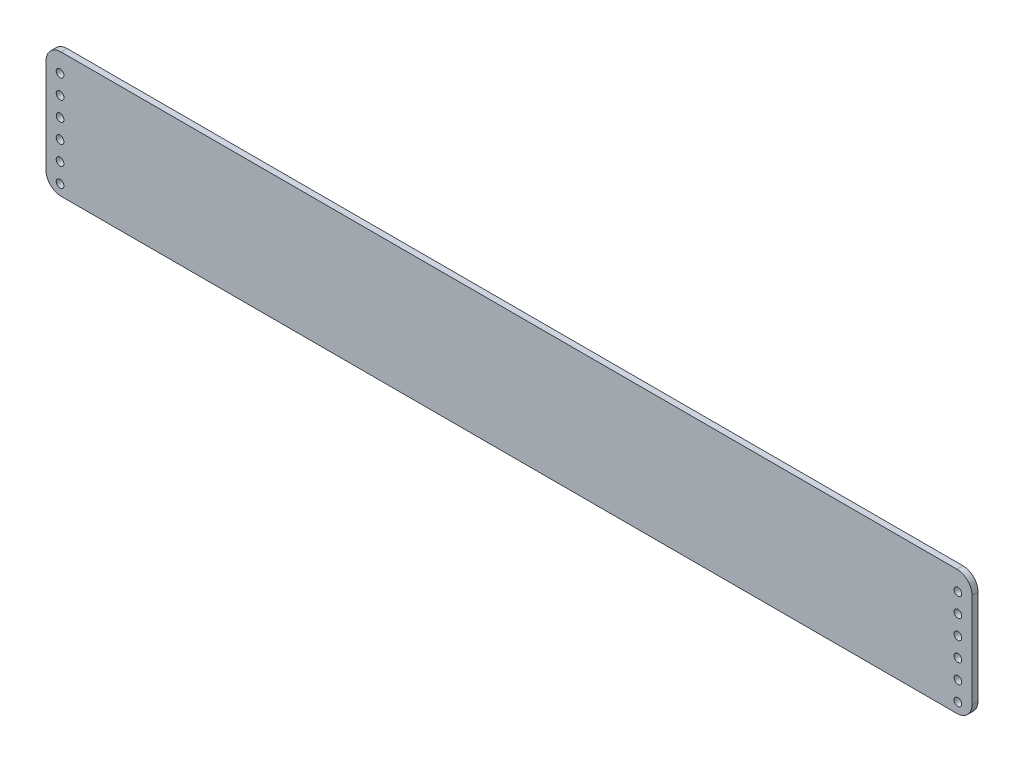
ISO-10303-21;
HEADER;
FILE_DESCRIPTION(('STEP AP214'),'2;1');
FILE_NAME('part.step','',(''),(''),'','','');
FILE_SCHEMA(('AUTOMOTIVE_DESIGN { 1 0 10303 214 1 1 1 1 }'));
ENDSEC;
DATA;
#1=APPLICATION_CONTEXT('core data for automotive mechanical design processes');
#2=APPLICATION_PROTOCOL_DEFINITION('international standard','automotive_design',2000,#1);
#3=PRODUCT_CONTEXT('',#1,'mechanical');
#4=PRODUCT('Part','Part','',(#3));
#5=PRODUCT_RELATED_PRODUCT_CATEGORY('part','',(#4));
#6=PRODUCT_DEFINITION_FORMATION('','',#4);
#7=PRODUCT_DEFINITION_CONTEXT('part definition',#1,'design');
#8=PRODUCT_DEFINITION('design','',#6,#7);
#9=PRODUCT_DEFINITION_SHAPE('','',#8);
#10=(LENGTH_UNIT() NAMED_UNIT(*) SI_UNIT(.MILLI.,.METRE.));
#11=(NAMED_UNIT(*) PLANE_ANGLE_UNIT() SI_UNIT($,.RADIAN.));
#12=(NAMED_UNIT(*) SI_UNIT($,.STERADIAN.) SOLID_ANGLE_UNIT());
#13=UNCERTAINTY_MEASURE_WITH_UNIT(LENGTH_MEASURE(1.E-05),#10,'distance_accuracy_value','');
#14=(GEOMETRIC_REPRESENTATION_CONTEXT(3) GLOBAL_UNCERTAINTY_ASSIGNED_CONTEXT((#13)) GLOBAL_UNIT_ASSIGNED_CONTEXT((#10,
#11,#12)) REPRESENTATION_CONTEXT('',''));
#15=CARTESIAN_POINT('',(0.,0.,0.));
#16=DIRECTION('',(0.,0.,1.));
#17=DIRECTION('',(1.,0.,0.));
#18=AXIS2_PLACEMENT_3D('',#15,#16,#17);
#19=CARTESIAN_POINT('',(0.,0.,4.));
#20=DIRECTION('',(0.,0.,1.));
#21=DIRECTION('',(1.,0.,0.));
#22=AXIS2_PLACEMENT_3D('',#19,#20,#21);
#23=PLANE('',#22);
#24=CARTESIAN_POINT('',(-298.155,28.8999999999998,4.));
#25=DIRECTION('',(0.,0.,1.));
#26=DIRECTION('',(1.,0.,0.));
#27=AXIS2_PLACEMENT_3D('',#24,#25,#26);
#28=CIRCLE('',#27,2.55499999999998);
#29=CARTESIAN_POINT('',(-295.6,28.8999999999998,4.));
#30=VERTEX_POINT('',#29);
#31=EDGE_CURVE('E238',#30,#30,#28,.T.);
#32=ORIENTED_EDGE('',*,*,#31,.F.);
#33=EDGE_LOOP('',(#32));
#34=FACE_BOUND('',#33,.T.);
#35=CARTESIAN_POINT('',(298.155,-21.9000000000002,4.));
#36=DIRECTION('',(0.,0.,1.));
#37=DIRECTION('',(-1.,0.,0.));
#38=AXIS2_PLACEMENT_3D('',#35,#36,#37);
#39=CIRCLE('',#38,2.55499999999998);
#40=CARTESIAN_POINT('',(295.6,-21.9000000000002,4.));
#41=VERTEX_POINT('',#40);
#42=EDGE_CURVE('E226',#41,#41,#39,.T.);
#43=ORIENTED_EDGE('',*,*,#42,.F.);
#44=EDGE_LOOP('',(#43));
#45=FACE_BOUND('',#44,.T.);
#46=CARTESIAN_POINT('',(298.155,3.49999999999982,4.));
#47=DIRECTION('',(0.,0.,1.));
#48=DIRECTION('',(-1.,0.,0.));
#49=AXIS2_PLACEMENT_3D('',#46,#47,#48);
#50=CIRCLE('',#49,2.55499999999998);
#51=CARTESIAN_POINT('',(295.6,3.49999999999982,4.));
#52=VERTEX_POINT('',#51);
#53=EDGE_CURVE('E214',#52,#52,#50,.T.);
#54=ORIENTED_EDGE('',*,*,#53,.F.);
#55=EDGE_LOOP('',(#54));
#56=FACE_BOUND('',#55,.T.);
#57=CARTESIAN_POINT('',(-298.155,16.1999999999998,4.));
#58=DIRECTION('',(0.,0.,1.));
#59=DIRECTION('',(1.,0.,0.));
#60=AXIS2_PLACEMENT_3D('',#57,#58,#59);
#61=CIRCLE('',#60,2.55499999999998);
#62=CARTESIAN_POINT('',(-295.6,16.1999999999998,4.));
#63=VERTEX_POINT('',#62);
#64=EDGE_CURVE('E202',#63,#63,#61,.T.);
#65=ORIENTED_EDGE('',*,*,#64,.F.);
#66=EDGE_LOOP('',(#65));
#67=FACE_BOUND('',#66,.T.);
#68=CARTESIAN_POINT('',(-298.155,-9.20000000000026,4.));
#69=DIRECTION('',(0.,0.,1.));
#70=DIRECTION('',(1.,0.,0.));
#71=AXIS2_PLACEMENT_3D('',#68,#69,#70);
#72=CIRCLE('',#71,2.55499999999998);
#73=CARTESIAN_POINT('',(-295.6,-9.20000000000026,4.));
#74=VERTEX_POINT('',#73);
#75=EDGE_CURVE('E190',#74,#74,#72,.T.);
#76=ORIENTED_EDGE('',*,*,#75,.F.);
#77=EDGE_LOOP('',(#76));
#78=FACE_BOUND('',#77,.T.);
#79=CARTESIAN_POINT('',(-298.155,-34.6000000000003,4.));
#80=DIRECTION('',(0.,0.,1.));
#81=DIRECTION('',(1.,0.,0.));
#82=AXIS2_PLACEMENT_3D('',#79,#80,#81);
#83=CIRCLE('',#82,2.55499999999998);
#84=CARTESIAN_POINT('',(-295.6,-34.6000000000003,4.));
#85=VERTEX_POINT('',#84);
#86=EDGE_CURVE('E174',#85,#85,#83,.T.);
#87=ORIENTED_EDGE('',*,*,#86,.F.);
#88=EDGE_LOOP('',(#87));
#89=FACE_BOUND('',#88,.T.);
#90=DIRECTION('',(0.,-1.,0.));
#91=VECTOR('',#90,1.);
#92=CARTESIAN_POINT('',(-307.5,41.5000000000002,4.));
#93=LINE('',#92,#91);
#94=CARTESIAN_POINT('',(-307.5,31.5000000000001,4.));
#95=VERTEX_POINT('',#94);
#96=CARTESIAN_POINT('',(-307.5,-31.5000000000003,4.));
#97=VERTEX_POINT('',#96);
#98=EDGE_CURVE('E178',#95,#97,#93,.T.);
#99=ORIENTED_EDGE('',*,*,#98,.T.);
#100=CARTESIAN_POINT('',(-297.5,-31.5000000000003,4.));
#101=DIRECTION('',(0.,0.,1.));
#102=DIRECTION('',(1.,0.,0.));
#103=AXIS2_PLACEMENT_3D('',#100,#101,#102);
#104=CIRCLE('',#103,10.);
#105=CARTESIAN_POINT('',(-297.5,-41.5000000000003,4.));
#106=VERTEX_POINT('',#105);
#107=EDGE_CURVE('E155',#97,#106,#104,.T.);
#108=ORIENTED_EDGE('',*,*,#107,.T.);
#109=DIRECTION('',(1.,0.,0.));
#110=VECTOR('',#109,1.);
#111=CARTESIAN_POINT('',(-307.5,-41.5000000000003,4.));
#112=LINE('',#111,#110);
#113=CARTESIAN_POINT('',(297.5,-41.5000000000002,4.));
#114=VERTEX_POINT('',#113);
#115=EDGE_CURVE('E126',#106,#114,#112,.T.);
#116=ORIENTED_EDGE('',*,*,#115,.T.);
#117=CARTESIAN_POINT('',(297.5,-31.5000000000002,4.));
#118=DIRECTION('',(0.,0.,1.));
#119=DIRECTION('',(1.,0.,0.));
#120=AXIS2_PLACEMENT_3D('',#117,#118,#119);
#121=CIRCLE('',#120,10.);
#122=CARTESIAN_POINT('',(307.5,-31.5000000000002,4.));
#123=VERTEX_POINT('',#122);
#124=EDGE_CURVE('E151',#114,#123,#121,.T.);
#125=ORIENTED_EDGE('',*,*,#124,.T.);
#126=DIRECTION('',(0.,1.,0.));
#127=VECTOR('',#126,1.);
#128=CARTESIAN_POINT('',(307.5,41.4999999999998,4.));
#129=LINE('',#128,#127);
#130=CARTESIAN_POINT('',(307.5,31.4999999999998,4.));
#131=VERTEX_POINT('',#130);
#132=EDGE_CURVE('E134',#123,#131,#129,.T.);
#133=ORIENTED_EDGE('',*,*,#132,.T.);
#134=CARTESIAN_POINT('',(297.5,31.4999999999998,4.));
#135=DIRECTION('',(0.,0.,1.));
#136=DIRECTION('',(1.,0.,0.));
#137=AXIS2_PLACEMENT_3D('',#134,#135,#136);
#138=CIRCLE('',#137,10.);
#139=CARTESIAN_POINT('',(297.5,41.4999999999998,4.));
#140=VERTEX_POINT('',#139);
#141=EDGE_CURVE('E61',#131,#140,#138,.T.);
#142=ORIENTED_EDGE('',*,*,#141,.T.);
#143=DIRECTION('',(-1.,0.,0.));
#144=VECTOR('',#143,1.);
#145=CARTESIAN_POINT('',(-307.5,41.5000000000002,4.));
#146=LINE('',#145,#144);
#147=CARTESIAN_POINT('',(-297.5,41.5000000000002,4.));
#148=VERTEX_POINT('',#147);
#149=EDGE_CURVE('E137',#140,#148,#146,.T.);
#150=ORIENTED_EDGE('',*,*,#149,.T.);
#151=CARTESIAN_POINT('',(-297.5,31.5000000000002,4.));
#152=DIRECTION('',(0.,0.,1.));
#153=DIRECTION('',(1.,0.,0.));
#154=AXIS2_PLACEMENT_3D('',#151,#152,#153);
#155=CIRCLE('',#154,10.);
#156=EDGE_CURVE('E153',#148,#95,#155,.T.);
#157=ORIENTED_EDGE('',*,*,#156,.T.);
#158=EDGE_LOOP('',(#99,#108,#116,#125,#133,#142,#150,#157));
#159=FACE_BOUND('',#158,.T.);
#160=CARTESIAN_POINT('',(-298.155,-21.9000000000003,4.));
#161=DIRECTION('',(0.,0.,1.));
#162=DIRECTION('',(1.,0.,0.));
#163=AXIS2_PLACEMENT_3D('',#160,#161,#162);
#164=CIRCLE('',#163,2.55499999999998);
#165=CARTESIAN_POINT('',(-295.6,-21.9000000000003,4.));
#166=VERTEX_POINT('',#165);
#167=EDGE_CURVE('E184',#166,#166,#164,.T.);
#168=ORIENTED_EDGE('',*,*,#167,.F.);
#169=EDGE_LOOP('',(#168));
#170=FACE_BOUND('',#169,.T.);
#171=CARTESIAN_POINT('',(-298.155,3.49999999999975,4.));
#172=DIRECTION('',(0.,0.,1.));
#173=DIRECTION('',(1.,0.,0.));
#174=AXIS2_PLACEMENT_3D('',#171,#172,#173);
#175=CIRCLE('',#174,2.55499999999998);
#176=CARTESIAN_POINT('',(-295.6,3.49999999999975,4.));
#177=VERTEX_POINT('',#176);
#178=EDGE_CURVE('E196',#177,#177,#175,.T.);
#179=ORIENTED_EDGE('',*,*,#178,.F.);
#180=EDGE_LOOP('',(#179));
#181=FACE_BOUND('',#180,.T.);
#182=CARTESIAN_POINT('',(298.155,16.1999999999998,4.));
#183=DIRECTION('',(0.,0.,1.));
#184=DIRECTION('',(-1.,0.,0.));
#185=AXIS2_PLACEMENT_3D('',#182,#183,#184);
#186=CIRCLE('',#185,2.55499999999998);
#187=CARTESIAN_POINT('',(295.6,16.1999999999998,4.));
#188=VERTEX_POINT('',#187);
#189=EDGE_CURVE('E208',#188,#188,#186,.T.);
#190=ORIENTED_EDGE('',*,*,#189,.F.);
#191=EDGE_LOOP('',(#190));
#192=FACE_BOUND('',#191,.T.);
#193=CARTESIAN_POINT('',(298.155,-9.20000000000018,4.));
#194=DIRECTION('',(0.,0.,1.));
#195=DIRECTION('',(-1.,0.,0.));
#196=AXIS2_PLACEMENT_3D('',#193,#194,#195);
#197=CIRCLE('',#196,2.55499999999998);
#198=CARTESIAN_POINT('',(295.6,-9.20000000000018,4.));
#199=VERTEX_POINT('',#198);
#200=EDGE_CURVE('E220',#199,#199,#197,.T.);
#201=ORIENTED_EDGE('',*,*,#200,.F.);
#202=EDGE_LOOP('',(#201));
#203=FACE_BOUND('',#202,.T.);
#204=CARTESIAN_POINT('',(298.155,-34.6000000000002,4.));
#205=DIRECTION('',(0.,0.,1.));
#206=DIRECTION('',(-1.,0.,0.));
#207=AXIS2_PLACEMENT_3D('',#204,#205,#206);
#208=CIRCLE('',#207,2.55499999999998);
#209=CARTESIAN_POINT('',(295.6,-34.6000000000002,4.));
#210=VERTEX_POINT('',#209);
#211=EDGE_CURVE('E232',#210,#210,#208,.T.);
#212=ORIENTED_EDGE('',*,*,#211,.F.);
#213=EDGE_LOOP('',(#212));
#214=FACE_BOUND('',#213,.T.);
#215=CARTESIAN_POINT('',(298.155,28.8999999999998,4.));
#216=DIRECTION('',(0.,0.,1.));
#217=DIRECTION('',(-1.,0.,0.));
#218=AXIS2_PLACEMENT_3D('',#215,#216,#217);
#219=CIRCLE('',#218,2.55499999999998);
#220=CARTESIAN_POINT('',(295.6,28.8999999999998,4.));
#221=VERTEX_POINT('',#220);
#222=EDGE_CURVE('E244',#221,#221,#219,.T.);
#223=ORIENTED_EDGE('',*,*,#222,.F.);
#224=EDGE_LOOP('',(#223));
#225=FACE_BOUND('',#224,.T.);
#226=ADVANCED_FACE('F39',(#34,#45,#56,#67,#78,#89,#159,#170,#181,#192,#203,#214,#225),#23,.T.);
#227=CARTESIAN_POINT('',(0.,0.,0.));
#228=DIRECTION('',(0.,0.,1.));
#229=DIRECTION('',(1.,0.,0.));
#230=AXIS2_PLACEMENT_3D('',#227,#228,#229);
#231=PLANE('',#230);
#232=DIRECTION('',(1.,0.,0.));
#233=VECTOR('',#232,1.);
#234=CARTESIAN_POINT('',(-307.5,-41.5000000000003,0.));
#235=LINE('',#234,#233);
#236=CARTESIAN_POINT('',(-297.5,-41.5000000000003,0.));
#237=VERTEX_POINT('',#236);
#238=CARTESIAN_POINT('',(297.5,-41.5000000000002,0.));
#239=VERTEX_POINT('',#238);
#240=EDGE_CURVE('E123',#237,#239,#235,.T.);
#241=ORIENTED_EDGE('',*,*,#240,.F.);
#242=CARTESIAN_POINT('',(-297.5,-31.5000000000003,0.));
#243=DIRECTION('',(0.,0.,1.));
#244=DIRECTION('',(1.,0.,0.));
#245=AXIS2_PLACEMENT_3D('',#242,#243,#244);
#246=CIRCLE('',#245,10.);
#247=CARTESIAN_POINT('',(-307.5,-31.5000000000003,0.));
#248=VERTEX_POINT('',#247);
#249=EDGE_CURVE('E106',#237,#248,#246,.F.);
#250=ORIENTED_EDGE('',*,*,#249,.T.);
#251=DIRECTION('',(0.,-1.,0.));
#252=VECTOR('',#251,1.);
#253=CARTESIAN_POINT('',(-307.5,41.5000000000002,0.));
#254=LINE('',#253,#252);
#255=CARTESIAN_POINT('',(-307.5,31.5000000000001,0.));
#256=VERTEX_POINT('',#255);
#257=EDGE_CURVE('E135',#256,#248,#254,.T.);
#258=ORIENTED_EDGE('',*,*,#257,.F.);
#259=CARTESIAN_POINT('',(-297.5,31.5000000000002,0.));
#260=DIRECTION('',(0.,0.,1.));
#261=DIRECTION('',(1.,0.,0.));
#262=AXIS2_PLACEMENT_3D('',#259,#260,#261);
#263=CIRCLE('',#262,10.);
#264=CARTESIAN_POINT('',(-297.5,41.5000000000002,0.));
#265=VERTEX_POINT('',#264);
#266=EDGE_CURVE('E117',#256,#265,#263,.F.);
#267=ORIENTED_EDGE('',*,*,#266,.T.);
#268=DIRECTION('',(-1.,0.,0.));
#269=VECTOR('',#268,1.);
#270=CARTESIAN_POINT('',(-307.5,41.5000000000002,0.));
#271=LINE('',#270,#269);
#272=CARTESIAN_POINT('',(297.5,41.4999999999998,0.));
#273=VERTEX_POINT('',#272);
#274=EDGE_CURVE('E139',#273,#265,#271,.T.);
#275=ORIENTED_EDGE('',*,*,#274,.F.);
#276=CARTESIAN_POINT('',(297.5,31.4999999999998,0.));
#277=DIRECTION('',(0.,0.,1.));
#278=DIRECTION('',(1.,0.,0.));
#279=AXIS2_PLACEMENT_3D('',#276,#277,#278);
#280=CIRCLE('',#279,10.);
#281=CARTESIAN_POINT('',(307.5,31.4999999999998,0.));
#282=VERTEX_POINT('',#281);
#283=EDGE_CURVE('E127',#273,#282,#280,.F.);
#284=ORIENTED_EDGE('',*,*,#283,.T.);
#285=DIRECTION('',(0.,1.,0.));
#286=VECTOR('',#285,1.);
#287=CARTESIAN_POINT('',(307.5,41.4999999999998,0.));
#288=LINE('',#287,#286);
#289=CARTESIAN_POINT('',(307.5,-31.5000000000002,0.));
#290=VERTEX_POINT('',#289);
#291=EDGE_CURVE('E166',#290,#282,#288,.T.);
#292=ORIENTED_EDGE('',*,*,#291,.F.);
#293=CARTESIAN_POINT('',(297.5,-31.5000000000002,0.));
#294=DIRECTION('',(0.,0.,1.));
#295=DIRECTION('',(1.,0.,0.));
#296=AXIS2_PLACEMENT_3D('',#293,#294,#295);
#297=CIRCLE('',#296,10.);
#298=EDGE_CURVE('E133',#290,#239,#297,.F.);
#299=ORIENTED_EDGE('',*,*,#298,.T.);
#300=EDGE_LOOP('',(#241,#250,#258,#267,#275,#284,#292,#299));
#301=FACE_BOUND('',#300,.T.);
#302=CARTESIAN_POINT('',(-298.155,-34.6000000000003,0.));
#303=DIRECTION('',(0.,0.,1.));
#304=DIRECTION('',(1.,0.,0.));
#305=AXIS2_PLACEMENT_3D('',#302,#303,#304);
#306=CIRCLE('',#305,2.55499999999998);
#307=CARTESIAN_POINT('',(-295.6,-34.6000000000003,0.));
#308=VERTEX_POINT('',#307);
#309=EDGE_CURVE('E181',#308,#308,#306,.T.);
#310=ORIENTED_EDGE('',*,*,#309,.T.);
#311=EDGE_LOOP('',(#310));
#312=FACE_BOUND('',#311,.T.);
#313=CARTESIAN_POINT('',(-298.155,-21.9000000000003,0.));
#314=DIRECTION('',(0.,0.,1.));
#315=DIRECTION('',(1.,0.,0.));
#316=AXIS2_PLACEMENT_3D('',#313,#314,#315);
#317=CIRCLE('',#316,2.55499999999998);
#318=CARTESIAN_POINT('',(-295.6,-21.9000000000003,0.));
#319=VERTEX_POINT('',#318);
#320=EDGE_CURVE('E187',#319,#319,#317,.T.);
#321=ORIENTED_EDGE('',*,*,#320,.T.);
#322=EDGE_LOOP('',(#321));
#323=FACE_BOUND('',#322,.T.);
#324=CARTESIAN_POINT('',(-298.155,-9.20000000000026,0.));
#325=DIRECTION('',(0.,0.,1.));
#326=DIRECTION('',(1.,0.,0.));
#327=AXIS2_PLACEMENT_3D('',#324,#325,#326);
#328=CIRCLE('',#327,2.55499999999998);
#329=CARTESIAN_POINT('',(-295.6,-9.20000000000026,0.));
#330=VERTEX_POINT('',#329);
#331=EDGE_CURVE('E193',#330,#330,#328,.T.);
#332=ORIENTED_EDGE('',*,*,#331,.T.);
#333=EDGE_LOOP('',(#332));
#334=FACE_BOUND('',#333,.T.);
#335=CARTESIAN_POINT('',(-298.155,3.49999999999975,0.));
#336=DIRECTION('',(0.,0.,1.));
#337=DIRECTION('',(1.,0.,0.));
#338=AXIS2_PLACEMENT_3D('',#335,#336,#337);
#339=CIRCLE('',#338,2.55499999999998);
#340=CARTESIAN_POINT('',(-295.6,3.49999999999975,0.));
#341=VERTEX_POINT('',#340);
#342=EDGE_CURVE('E199',#341,#341,#339,.T.);
#343=ORIENTED_EDGE('',*,*,#342,.T.);
#344=EDGE_LOOP('',(#343));
#345=FACE_BOUND('',#344,.T.);
#346=CARTESIAN_POINT('',(-298.155,16.1999999999998,0.));
#347=DIRECTION('',(0.,0.,1.));
#348=DIRECTION('',(1.,0.,0.));
#349=AXIS2_PLACEMENT_3D('',#346,#347,#348);
#350=CIRCLE('',#349,2.55499999999998);
#351=CARTESIAN_POINT('',(-295.6,16.1999999999998,0.));
#352=VERTEX_POINT('',#351);
#353=EDGE_CURVE('E205',#352,#352,#350,.T.);
#354=ORIENTED_EDGE('',*,*,#353,.T.);
#355=EDGE_LOOP('',(#354));
#356=FACE_BOUND('',#355,.T.);
#357=CARTESIAN_POINT('',(298.155,16.1999999999998,0.));
#358=DIRECTION('',(0.,0.,1.));
#359=DIRECTION('',(-1.,0.,0.));
#360=AXIS2_PLACEMENT_3D('',#357,#358,#359);
#361=CIRCLE('',#360,2.55499999999998);
#362=CARTESIAN_POINT('',(295.6,16.1999999999998,0.));
#363=VERTEX_POINT('',#362);
#364=EDGE_CURVE('E211',#363,#363,#361,.T.);
#365=ORIENTED_EDGE('',*,*,#364,.T.);
#366=EDGE_LOOP('',(#365));
#367=FACE_BOUND('',#366,.T.);
#368=CARTESIAN_POINT('',(298.155,3.49999999999982,0.));
#369=DIRECTION('',(0.,0.,1.));
#370=DIRECTION('',(-1.,0.,0.));
#371=AXIS2_PLACEMENT_3D('',#368,#369,#370);
#372=CIRCLE('',#371,2.55499999999998);
#373=CARTESIAN_POINT('',(295.6,3.49999999999982,0.));
#374=VERTEX_POINT('',#373);
#375=EDGE_CURVE('E217',#374,#374,#372,.T.);
#376=ORIENTED_EDGE('',*,*,#375,.T.);
#377=EDGE_LOOP('',(#376));
#378=FACE_BOUND('',#377,.T.);
#379=CARTESIAN_POINT('',(298.155,-9.20000000000018,0.));
#380=DIRECTION('',(0.,0.,1.));
#381=DIRECTION('',(-1.,0.,0.));
#382=AXIS2_PLACEMENT_3D('',#379,#380,#381);
#383=CIRCLE('',#382,2.55499999999998);
#384=CARTESIAN_POINT('',(295.6,-9.20000000000018,0.));
#385=VERTEX_POINT('',#384);
#386=EDGE_CURVE('E223',#385,#385,#383,.T.);
#387=ORIENTED_EDGE('',*,*,#386,.T.);
#388=EDGE_LOOP('',(#387));
#389=FACE_BOUND('',#388,.T.);
#390=CARTESIAN_POINT('',(298.155,-21.9000000000002,0.));
#391=DIRECTION('',(0.,0.,1.));
#392=DIRECTION('',(-1.,0.,0.));
#393=AXIS2_PLACEMENT_3D('',#390,#391,#392);
#394=CIRCLE('',#393,2.55499999999998);
#395=CARTESIAN_POINT('',(295.6,-21.9000000000002,0.));
#396=VERTEX_POINT('',#395);
#397=EDGE_CURVE('E229',#396,#396,#394,.T.);
#398=ORIENTED_EDGE('',*,*,#397,.T.);
#399=EDGE_LOOP('',(#398));
#400=FACE_BOUND('',#399,.T.);
#401=CARTESIAN_POINT('',(298.155,-34.6000000000002,0.));
#402=DIRECTION('',(0.,0.,1.));
#403=DIRECTION('',(-1.,0.,0.));
#404=AXIS2_PLACEMENT_3D('',#401,#402,#403);
#405=CIRCLE('',#404,2.55499999999998);
#406=CARTESIAN_POINT('',(295.6,-34.6000000000002,0.));
#407=VERTEX_POINT('',#406);
#408=EDGE_CURVE('E235',#407,#407,#405,.T.);
#409=ORIENTED_EDGE('',*,*,#408,.T.);
#410=EDGE_LOOP('',(#409));
#411=FACE_BOUND('',#410,.T.);
#412=CARTESIAN_POINT('',(-298.155,28.8999999999998,0.));
#413=DIRECTION('',(0.,0.,1.));
#414=DIRECTION('',(1.,0.,0.));
#415=AXIS2_PLACEMENT_3D('',#412,#413,#414);
#416=CIRCLE('',#415,2.55499999999998);
#417=CARTESIAN_POINT('',(-295.6,28.8999999999998,0.));
#418=VERTEX_POINT('',#417);
#419=EDGE_CURVE('E241',#418,#418,#416,.T.);
#420=ORIENTED_EDGE('',*,*,#419,.T.);
#421=EDGE_LOOP('',(#420));
#422=FACE_BOUND('',#421,.T.);
#423=CARTESIAN_POINT('',(298.155,28.8999999999998,0.));
#424=DIRECTION('',(0.,0.,1.));
#425=DIRECTION('',(-1.,0.,0.));
#426=AXIS2_PLACEMENT_3D('',#423,#424,#425);
#427=CIRCLE('',#426,2.55499999999998);
#428=CARTESIAN_POINT('',(295.6,28.8999999999998,0.));
#429=VERTEX_POINT('',#428);
#430=EDGE_CURVE('E247',#429,#429,#427,.T.);
#431=ORIENTED_EDGE('',*,*,#430,.T.);
#432=EDGE_LOOP('',(#431));
#433=FACE_BOUND('',#432,.T.);
#434=ADVANCED_FACE('F130',(#301,#312,#323,#334,#345,#356,#367,#378,#389,#400,#411,#422,#433),
#231,.F.);
#435=CARTESIAN_POINT('',(307.5,41.4999999999998,4.));
#436=DIRECTION('',(-1.,0.,0.));
#437=DIRECTION('',(0.,-1.,0.));
#438=AXIS2_PLACEMENT_3D('',#435,#436,#437);
#439=PLANE('',#438);
#440=ORIENTED_EDGE('',*,*,#132,.F.);
#441=DIRECTION('',(0.,0.,-1.));
#442=VECTOR('',#441,1.);
#443=CARTESIAN_POINT('',(307.5,-31.5000000000002,4.));
#444=LINE('',#443,#442);
#445=EDGE_CURVE('E11',#123,#290,#444,.T.);
#446=ORIENTED_EDGE('',*,*,#445,.T.);
#447=ORIENTED_EDGE('',*,*,#291,.T.);
#448=DIRECTION('',(0.,0.,-1.));
#449=VECTOR('',#448,1.);
#450=CARTESIAN_POINT('',(307.5,31.4999999999998,4.));
#451=LINE('',#450,#449);
#452=EDGE_CURVE('E47',#282,#131,#451,.F.);
#453=ORIENTED_EDGE('',*,*,#452,.T.);
#454=EDGE_LOOP('',(#440,#446,#447,#453));
#455=FACE_BOUND('',#454,.T.);
#456=ADVANCED_FACE('F164',(#455),#439,.F.);
#457=CARTESIAN_POINT('',(-307.5,41.5000000000002,4.));
#458=DIRECTION('',(0.,-1.,0.));
#459=DIRECTION('',(1.,0.,0.));
#460=AXIS2_PLACEMENT_3D('',#457,#458,#459);
#461=PLANE('',#460);
#462=ORIENTED_EDGE('',*,*,#274,.T.);
#463=DIRECTION('',(0.,0.,-1.));
#464=VECTOR('',#463,1.);
#465=CARTESIAN_POINT('',(-297.5,41.5000000000002,4.));
#466=LINE('',#465,#464);
#467=EDGE_CURVE('E54',#265,#148,#466,.F.);
#468=ORIENTED_EDGE('',*,*,#467,.T.);
#469=ORIENTED_EDGE('',*,*,#149,.F.);
#470=DIRECTION('',(0.,0.,-1.));
#471=VECTOR('',#470,1.);
#472=CARTESIAN_POINT('',(297.5,41.4999999999998,4.));
#473=LINE('',#472,#471);
#474=EDGE_CURVE('E157',#140,#273,#473,.T.);
#475=ORIENTED_EDGE('',*,*,#474,.T.);
#476=EDGE_LOOP('',(#462,#468,#469,#475));
#477=FACE_BOUND('',#476,.T.);
#478=ADVANCED_FACE('F173',(#477),#461,.F.);
#479=CARTESIAN_POINT('',(-307.5,41.5000000000002,4.));
#480=DIRECTION('',(1.,0.,0.));
#481=DIRECTION('',(0.,1.,0.));
#482=AXIS2_PLACEMENT_3D('',#479,#480,#481);
#483=PLANE('',#482);
#484=ORIENTED_EDGE('',*,*,#257,.T.);
#485=DIRECTION('',(0.,0.,-1.));
#486=VECTOR('',#485,1.);
#487=CARTESIAN_POINT('',(-307.5,-31.5000000000003,4.));
#488=LINE('',#487,#486);
#489=EDGE_CURVE('E111',#248,#97,#488,.F.);
#490=ORIENTED_EDGE('',*,*,#489,.T.);
#491=ORIENTED_EDGE('',*,*,#98,.F.);
#492=DIRECTION('',(0.,0.,-1.));
#493=VECTOR('',#492,1.);
#494=CARTESIAN_POINT('',(-307.5,31.5000000000001,4.));
#495=LINE('',#494,#493);
#496=EDGE_CURVE('E116',#95,#256,#495,.T.);
#497=ORIENTED_EDGE('',*,*,#496,.T.);
#498=EDGE_LOOP('',(#484,#490,#491,#497));
#499=FACE_BOUND('',#498,.T.);
#500=ADVANCED_FACE('F272',(#499),#483,.F.);
#501=CARTESIAN_POINT('',(-307.5,-41.5000000000003,4.));
#502=DIRECTION('',(0.,1.,0.));
#503=DIRECTION('',(-1.,0.,0.));
#504=AXIS2_PLACEMENT_3D('',#501,#502,#503);
#505=PLANE('',#504);
#506=ORIENTED_EDGE('',*,*,#115,.F.);
#507=DIRECTION('',(0.,0.,-1.));
#508=VECTOR('',#507,1.);
#509=CARTESIAN_POINT('',(-297.5,-41.5000000000003,4.));
#510=LINE('',#509,#508);
#511=EDGE_CURVE('E110',#106,#237,#510,.T.);
#512=ORIENTED_EDGE('',*,*,#511,.T.);
#513=ORIENTED_EDGE('',*,*,#240,.T.);
#514=DIRECTION('',(0.,0.,-1.));
#515=VECTOR('',#514,1.);
#516=CARTESIAN_POINT('',(297.5,-41.5000000000002,4.));
#517=LINE('',#516,#515);
#518=EDGE_CURVE('E128',#239,#114,#517,.F.);
#519=ORIENTED_EDGE('',*,*,#518,.T.);
#520=EDGE_LOOP('',(#506,#512,#513,#519));
#521=FACE_BOUND('',#520,.T.);
#522=ADVANCED_FACE('F122',(#521),#505,.F.);
#523=CARTESIAN_POINT('',(-298.155,-34.6000000000003,4.));
#524=DIRECTION('',(0.,0.,-1.));
#525=DIRECTION('',(-1.,0.,0.));
#526=AXIS2_PLACEMENT_3D('',#523,#524,#525);
#527=CYLINDRICAL_SURFACE('',#526,2.55499999999998);
#528=ORIENTED_EDGE('',*,*,#86,.T.);
#529=EDGE_LOOP('',(#528));
#530=FACE_BOUND('',#529,.T.);
#531=ORIENTED_EDGE('',*,*,#309,.F.);
#532=EDGE_LOOP('',(#531));
#533=FACE_BOUND('',#532,.T.);
#534=ADVANCED_FACE('F267',(#530,#533),#527,.F.);
#535=CARTESIAN_POINT('',(-298.155,-21.9000000000003,4.));
#536=DIRECTION('',(0.,0.,-1.));
#537=DIRECTION('',(-1.,0.,0.));
#538=AXIS2_PLACEMENT_3D('',#535,#536,#537);
#539=CYLINDRICAL_SURFACE('',#538,2.55499999999998);
#540=ORIENTED_EDGE('',*,*,#167,.T.);
#541=EDGE_LOOP('',(#540));
#542=FACE_BOUND('',#541,.T.);
#543=ORIENTED_EDGE('',*,*,#320,.F.);
#544=EDGE_LOOP('',(#543));
#545=FACE_BOUND('',#544,.T.);
#546=ADVANCED_FACE('F410',(#542,#545),#539,.F.);
#547=CARTESIAN_POINT('',(-298.155,-9.20000000000026,4.));
#548=DIRECTION('',(0.,0.,-1.));
#549=DIRECTION('',(-1.,0.,0.));
#550=AXIS2_PLACEMENT_3D('',#547,#548,#549);
#551=CYLINDRICAL_SURFACE('',#550,2.55499999999998);
#552=ORIENTED_EDGE('',*,*,#75,.T.);
#553=EDGE_LOOP('',(#552));
#554=FACE_BOUND('',#553,.T.);
#555=ORIENTED_EDGE('',*,*,#331,.F.);
#556=EDGE_LOOP('',(#555));
#557=FACE_BOUND('',#556,.T.);
#558=ADVANCED_FACE('F400',(#554,#557),#551,.F.);
#559=CARTESIAN_POINT('',(-298.155,3.49999999999975,4.));
#560=DIRECTION('',(0.,0.,-1.));
#561=DIRECTION('',(-1.,0.,0.));
#562=AXIS2_PLACEMENT_3D('',#559,#560,#561);
#563=CYLINDRICAL_SURFACE('',#562,2.55499999999998);
#564=ORIENTED_EDGE('',*,*,#178,.T.);
#565=EDGE_LOOP('',(#564));
#566=FACE_BOUND('',#565,.T.);
#567=ORIENTED_EDGE('',*,*,#342,.F.);
#568=EDGE_LOOP('',(#567));
#569=FACE_BOUND('',#568,.T.);
#570=ADVANCED_FACE('F390',(#566,#569),#563,.F.);
#571=CARTESIAN_POINT('',(-298.155,16.1999999999998,4.));
#572=DIRECTION('',(0.,0.,-1.));
#573=DIRECTION('',(-1.,0.,0.));
#574=AXIS2_PLACEMENT_3D('',#571,#572,#573);
#575=CYLINDRICAL_SURFACE('',#574,2.55499999999998);
#576=ORIENTED_EDGE('',*,*,#64,.T.);
#577=EDGE_LOOP('',(#576));
#578=FACE_BOUND('',#577,.T.);
#579=ORIENTED_EDGE('',*,*,#353,.F.);
#580=EDGE_LOOP('',(#579));
#581=FACE_BOUND('',#580,.T.);
#582=ADVANCED_FACE('F380',(#578,#581),#575,.F.);
#583=CARTESIAN_POINT('',(298.155,16.1999999999998,4.));
#584=DIRECTION('',(0.,0.,-1.));
#585=DIRECTION('',(-1.,0.,0.));
#586=AXIS2_PLACEMENT_3D('',#583,#584,#585);
#587=CYLINDRICAL_SURFACE('',#586,2.55499999999998);
#588=ORIENTED_EDGE('',*,*,#189,.T.);
#589=EDGE_LOOP('',(#588));
#590=FACE_BOUND('',#589,.T.);
#591=ORIENTED_EDGE('',*,*,#364,.F.);
#592=EDGE_LOOP('',(#591));
#593=FACE_BOUND('',#592,.T.);
#594=ADVANCED_FACE('F370',(#590,#593),#587,.F.);
#595=CARTESIAN_POINT('',(298.155,3.49999999999982,4.));
#596=DIRECTION('',(0.,0.,-1.));
#597=DIRECTION('',(-1.,0.,0.));
#598=AXIS2_PLACEMENT_3D('',#595,#596,#597);
#599=CYLINDRICAL_SURFACE('',#598,2.55499999999998);
#600=ORIENTED_EDGE('',*,*,#53,.T.);
#601=EDGE_LOOP('',(#600));
#602=FACE_BOUND('',#601,.T.);
#603=ORIENTED_EDGE('',*,*,#375,.F.);
#604=EDGE_LOOP('',(#603));
#605=FACE_BOUND('',#604,.T.);
#606=ADVANCED_FACE('F360',(#602,#605),#599,.F.);
#607=CARTESIAN_POINT('',(298.155,-9.20000000000018,4.));
#608=DIRECTION('',(0.,0.,-1.));
#609=DIRECTION('',(-1.,0.,0.));
#610=AXIS2_PLACEMENT_3D('',#607,#608,#609);
#611=CYLINDRICAL_SURFACE('',#610,2.55499999999998);
#612=ORIENTED_EDGE('',*,*,#200,.T.);
#613=EDGE_LOOP('',(#612));
#614=FACE_BOUND('',#613,.T.);
#615=ORIENTED_EDGE('',*,*,#386,.F.);
#616=EDGE_LOOP('',(#615));
#617=FACE_BOUND('',#616,.T.);
#618=ADVANCED_FACE('F350',(#614,#617),#611,.F.);
#619=CARTESIAN_POINT('',(298.155,-21.9000000000002,4.));
#620=DIRECTION('',(0.,0.,-1.));
#621=DIRECTION('',(-1.,0.,0.));
#622=AXIS2_PLACEMENT_3D('',#619,#620,#621);
#623=CYLINDRICAL_SURFACE('',#622,2.55499999999998);
#624=ORIENTED_EDGE('',*,*,#42,.T.);
#625=EDGE_LOOP('',(#624));
#626=FACE_BOUND('',#625,.T.);
#627=ORIENTED_EDGE('',*,*,#397,.F.);
#628=EDGE_LOOP('',(#627));
#629=FACE_BOUND('',#628,.T.);
#630=ADVANCED_FACE('F340',(#626,#629),#623,.F.);
#631=CARTESIAN_POINT('',(298.155,-34.6000000000002,4.));
#632=DIRECTION('',(0.,0.,-1.));
#633=DIRECTION('',(-1.,0.,0.));
#634=AXIS2_PLACEMENT_3D('',#631,#632,#633);
#635=CYLINDRICAL_SURFACE('',#634,2.55499999999998);
#636=ORIENTED_EDGE('',*,*,#211,.T.);
#637=EDGE_LOOP('',(#636));
#638=FACE_BOUND('',#637,.T.);
#639=ORIENTED_EDGE('',*,*,#408,.F.);
#640=EDGE_LOOP('',(#639));
#641=FACE_BOUND('',#640,.T.);
#642=ADVANCED_FACE('F330',(#638,#641),#635,.F.);
#643=CARTESIAN_POINT('',(-298.155,28.8999999999998,4.));
#644=DIRECTION('',(0.,0.,-1.));
#645=DIRECTION('',(-1.,0.,0.));
#646=AXIS2_PLACEMENT_3D('',#643,#644,#645);
#647=CYLINDRICAL_SURFACE('',#646,2.55499999999998);
#648=ORIENTED_EDGE('',*,*,#31,.T.);
#649=EDGE_LOOP('',(#648));
#650=FACE_BOUND('',#649,.T.);
#651=ORIENTED_EDGE('',*,*,#419,.F.);
#652=EDGE_LOOP('',(#651));
#653=FACE_BOUND('',#652,.T.);
#654=ADVANCED_FACE('F321',(#650,#653),#647,.F.);
#655=CARTESIAN_POINT('',(298.155,28.8999999999998,4.));
#656=DIRECTION('',(0.,0.,-1.));
#657=DIRECTION('',(-1.,0.,0.));
#658=AXIS2_PLACEMENT_3D('',#655,#656,#657);
#659=CYLINDRICAL_SURFACE('',#658,2.55499999999998);
#660=ORIENTED_EDGE('',*,*,#222,.T.);
#661=EDGE_LOOP('',(#660));
#662=FACE_BOUND('',#661,.T.);
#663=ORIENTED_EDGE('',*,*,#430,.F.);
#664=EDGE_LOOP('',(#663));
#665=FACE_BOUND('',#664,.T.);
#666=ADVANCED_FACE('F253',(#662,#665),#659,.F.);
#667=CARTESIAN_POINT('',(-297.5,-31.5000000000003,4.));
#668=DIRECTION('',(0.,0.,-1.));
#669=DIRECTION('',(-1.,0.,0.));
#670=AXIS2_PLACEMENT_3D('',#667,#668,#669);
#671=CYLINDRICAL_SURFACE('',#670,10.);
#672=ORIENTED_EDGE('',*,*,#107,.F.);
#673=ORIENTED_EDGE('',*,*,#489,.F.);
#674=ORIENTED_EDGE('',*,*,#249,.F.);
#675=ORIENTED_EDGE('',*,*,#511,.F.);
#676=EDGE_LOOP('',(#672,#673,#674,#675));
#677=FACE_BOUND('',#676,.T.);
#678=ADVANCED_FACE('F109',(#677),#671,.T.);
#679=CARTESIAN_POINT('',(-297.5,31.5000000000002,4.));
#680=DIRECTION('',(0.,0.,-1.));
#681=DIRECTION('',(-1.,0.,0.));
#682=AXIS2_PLACEMENT_3D('',#679,#680,#681);
#683=CYLINDRICAL_SURFACE('',#682,10.);
#684=ORIENTED_EDGE('',*,*,#156,.F.);
#685=ORIENTED_EDGE('',*,*,#467,.F.);
#686=ORIENTED_EDGE('',*,*,#266,.F.);
#687=ORIENTED_EDGE('',*,*,#496,.F.);
#688=EDGE_LOOP('',(#684,#685,#686,#687));
#689=FACE_BOUND('',#688,.T.);
#690=ADVANCED_FACE('F282',(#689),#683,.T.);
#691=CARTESIAN_POINT('',(297.5,-31.5000000000002,4.));
#692=DIRECTION('',(0.,0.,-1.));
#693=DIRECTION('',(-1.,0.,0.));
#694=AXIS2_PLACEMENT_3D('',#691,#692,#693);
#695=CYLINDRICAL_SURFACE('',#694,10.);
#696=ORIENTED_EDGE('',*,*,#124,.F.);
#697=ORIENTED_EDGE('',*,*,#518,.F.);
#698=ORIENTED_EDGE('',*,*,#298,.F.);
#699=ORIENTED_EDGE('',*,*,#445,.F.);
#700=EDGE_LOOP('',(#696,#697,#698,#699));
#701=FACE_BOUND('',#700,.T.);
#702=ADVANCED_FACE('F284',(#701),#695,.T.);
#703=CARTESIAN_POINT('',(297.5,31.4999999999998,4.));
#704=DIRECTION('',(0.,0.,-1.));
#705=DIRECTION('',(-1.,0.,0.));
#706=AXIS2_PLACEMENT_3D('',#703,#704,#705);
#707=CYLINDRICAL_SURFACE('',#706,10.);
#708=ORIENTED_EDGE('',*,*,#141,.F.);
#709=ORIENTED_EDGE('',*,*,#452,.F.);
#710=ORIENTED_EDGE('',*,*,#283,.F.);
#711=ORIENTED_EDGE('',*,*,#474,.F.);
#712=EDGE_LOOP('',(#708,#709,#710,#711));
#713=FACE_BOUND('',#712,.T.);
#714=ADVANCED_FACE('F41',(#713),#707,.T.);
#715=CLOSED_SHELL('',(#226,#434,#456,#478,#500,#522,#534,#546,#558,#570,#582,#594,#606,#618,
#630,#642,#654,#666,#678,#690,#702,#714));
#716=MANIFOLD_SOLID_BREP('B2',#715);
#717=ADVANCED_BREP_SHAPE_REPRESENTATION('',(#18,#716),#14);
#718=SHAPE_DEFINITION_REPRESENTATION(#9,#717);
ENDSEC;
END-ISO-10303-21;
